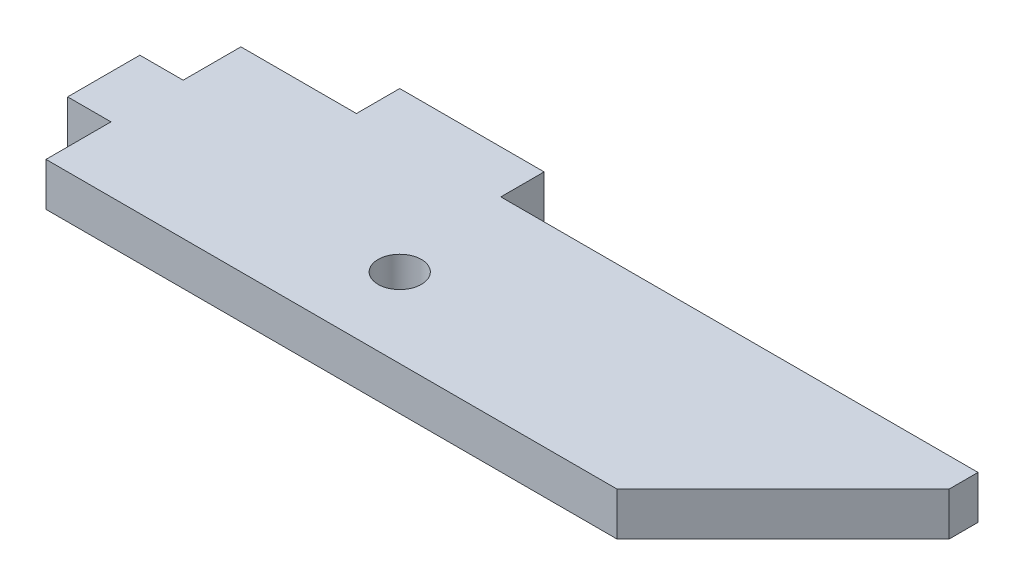
ISO-10303-21;
HEADER;
FILE_DESCRIPTION(('STEP AP214'),'2;1');
FILE_NAME('part.step','',(''),(''),'','','');
FILE_SCHEMA(('AUTOMOTIVE_DESIGN { 1 0 10303 214 1 1 1 1 }'));
ENDSEC;
DATA;
#1=APPLICATION_CONTEXT('core data for automotive mechanical design processes');
#2=APPLICATION_PROTOCOL_DEFINITION('international standard','automotive_design',2000,#1);
#3=PRODUCT_CONTEXT('',#1,'mechanical');
#4=PRODUCT('Part','Part','',(#3));
#5=PRODUCT_RELATED_PRODUCT_CATEGORY('part','',(#4));
#6=PRODUCT_DEFINITION_FORMATION('','',#4);
#7=PRODUCT_DEFINITION_CONTEXT('part definition',#1,'design');
#8=PRODUCT_DEFINITION('design','',#6,#7);
#9=PRODUCT_DEFINITION_SHAPE('','',#8);
#10=(LENGTH_UNIT() NAMED_UNIT(*) SI_UNIT(.MILLI.,.METRE.));
#11=(NAMED_UNIT(*) PLANE_ANGLE_UNIT() SI_UNIT($,.RADIAN.));
#12=(NAMED_UNIT(*) SI_UNIT($,.STERADIAN.) SOLID_ANGLE_UNIT());
#13=UNCERTAINTY_MEASURE_WITH_UNIT(LENGTH_MEASURE(1.E-05),#10,'distance_accuracy_value','');
#14=(GEOMETRIC_REPRESENTATION_CONTEXT(3) GLOBAL_UNCERTAINTY_ASSIGNED_CONTEXT((#13)) GLOBAL_UNIT_ASSIGNED_CONTEXT((#10,
#11,#12)) REPRESENTATION_CONTEXT('',''));
#15=CARTESIAN_POINT('',(0.,0.,0.));
#16=DIRECTION('',(0.,0.,1.));
#17=DIRECTION('',(1.,0.,0.));
#18=AXIS2_PLACEMENT_3D('',#15,#16,#17);
#19=CARTESIAN_POINT('',(0.,3.,0.));
#20=DIRECTION('',(0.,-1.,0.));
#21=DIRECTION('',(0.,0.,-1.));
#22=AXIS2_PLACEMENT_3D('',#19,#20,#21);
#23=PLANE('',#22);
#24=DIRECTION('',(0.,0.,1.));
#25=VECTOR('',#24,1.);
#26=CARTESIAN_POINT('',(-55.3800021183695,3.,9.08659696226554));
#27=LINE('',#26,#25);
#28=CARTESIAN_POINT('',(-55.3800021183695,3.,4.58659696226555));
#29=VERTEX_POINT('',#28);
#30=CARTESIAN_POINT('',(-55.3800021183695,3.,9.08659696226554));
#31=VERTEX_POINT('',#30);
#32=EDGE_CURVE('E185',#29,#31,#27,.T.);
#33=ORIENTED_EDGE('',*,*,#32,.T.);
#34=DIRECTION('',(1.,0.,0.));
#35=VECTOR('',#34,1.);
#36=CARTESIAN_POINT('',(-15.8200021183695,3.,9.08659696226553));
#37=LINE('',#36,#35);
#38=CARTESIAN_POINT('',(-15.8200021183695,3.,9.08659696226553));
#39=VERTEX_POINT('',#38);
#40=EDGE_CURVE('E108',#31,#39,#37,.T.);
#41=ORIENTED_EDGE('',*,*,#40,.T.);
#42=DIRECTION('',(0.707106781186546,0.,-0.707106781186549));
#43=VECTOR('',#42,1.);
#44=CARTESIAN_POINT('',(-4.33000211836955,3.,-2.4034030377345));
#45=LINE('',#44,#43);
#46=CARTESIAN_POINT('',(-4.33000211836955,3.,-2.4034030377345));
#47=VERTEX_POINT('',#46);
#48=EDGE_CURVE('E215',#39,#47,#45,.T.);
#49=ORIENTED_EDGE('',*,*,#48,.T.);
#50=DIRECTION('',(0.,0.,-1.));
#51=VECTOR('',#50,1.);
#52=CARTESIAN_POINT('',(-4.33000211836955,3.,-4.41340303773464));
#53=LINE('',#52,#51);
#54=CARTESIAN_POINT('',(-4.33000211836955,3.,-4.41340303773464));
#55=VERTEX_POINT('',#54);
#56=EDGE_CURVE('E234',#47,#55,#53,.T.);
#57=ORIENTED_EDGE('',*,*,#56,.T.);
#58=DIRECTION('',(-1.,0.,0.));
#59=VECTOR('',#58,1.);
#60=CARTESIAN_POINT('',(-37.3800021183695,3.,-4.41340303773446));
#61=LINE('',#60,#59);
#62=CARTESIAN_POINT('',(-37.3800021183695,3.,-4.41340303773446));
#63=VERTEX_POINT('',#62);
#64=EDGE_CURVE('E231',#55,#63,#61,.T.);
#65=ORIENTED_EDGE('',*,*,#64,.T.);
#66=DIRECTION('',(0.,0.,-1.));
#67=VECTOR('',#66,1.);
#68=CARTESIAN_POINT('',(-37.3800021183695,3.,-7.41340303773446));
#69=LINE('',#68,#67);
#70=CARTESIAN_POINT('',(-37.3800021183695,3.,-7.41340303773446));
#71=VERTEX_POINT('',#70);
#72=EDGE_CURVE('E233',#63,#71,#69,.T.);
#73=ORIENTED_EDGE('',*,*,#72,.T.);
#74=DIRECTION('',(-1.,0.,0.));
#75=VECTOR('',#74,1.);
#76=CARTESIAN_POINT('',(-47.3800021183695,3.,-7.41340303773446));
#77=LINE('',#76,#75);
#78=CARTESIAN_POINT('',(-47.3800021183695,3.,-7.41340303773446));
#79=VERTEX_POINT('',#78);
#80=EDGE_CURVE('E236',#71,#79,#77,.T.);
#81=ORIENTED_EDGE('',*,*,#80,.T.);
#82=DIRECTION('',(0.,0.,1.));
#83=VECTOR('',#82,1.);
#84=CARTESIAN_POINT('',(-47.3800021183695,3.,-7.41340303773446));
#85=LINE('',#84,#83);
#86=CARTESIAN_POINT('',(-47.3800021183695,3.,-4.41340303773446));
#87=VERTEX_POINT('',#86);
#88=EDGE_CURVE('E242',#79,#87,#85,.T.);
#89=ORIENTED_EDGE('',*,*,#88,.T.);
#90=DIRECTION('',(-1.,0.,0.));
#91=VECTOR('',#90,1.);
#92=CARTESIAN_POINT('',(-47.3800021183695,3.,-4.41340303773446));
#93=LINE('',#92,#91);
#94=CARTESIAN_POINT('',(-55.3800021183695,3.,-4.41340303773446));
#95=VERTEX_POINT('',#94);
#96=EDGE_CURVE('E244',#87,#95,#93,.T.);
#97=ORIENTED_EDGE('',*,*,#96,.T.);
#98=DIRECTION('',(0.,0.,1.));
#99=VECTOR('',#98,1.);
#100=CARTESIAN_POINT('',(-55.3800021183696,3.,-0.413403037734454));
#101=LINE('',#100,#99);
#102=CARTESIAN_POINT('',(-55.3800021183696,3.,-0.413403037734454));
#103=VERTEX_POINT('',#102);
#104=EDGE_CURVE('E142',#95,#103,#101,.T.);
#105=ORIENTED_EDGE('',*,*,#104,.T.);
#106=DIRECTION('',(-1.,0.,0.));
#107=VECTOR('',#106,1.);
#108=CARTESIAN_POINT('',(-55.3800021183696,3.,-0.413403037734454));
#109=LINE('',#108,#107);
#110=CARTESIAN_POINT('',(-58.3800021183695,3.,-0.413403037734454));
#111=VERTEX_POINT('',#110);
#112=EDGE_CURVE('E136',#103,#111,#109,.T.);
#113=ORIENTED_EDGE('',*,*,#112,.T.);
#114=DIRECTION('',(0.,0.,1.));
#115=VECTOR('',#114,1.);
#116=CARTESIAN_POINT('',(-58.3800021183695,3.,-0.413403037734454));
#117=LINE('',#116,#115);
#118=CARTESIAN_POINT('',(-58.3800021183696,3.,4.58659696226555));
#119=VERTEX_POINT('',#118);
#120=EDGE_CURVE('E140',#111,#119,#117,.T.);
#121=ORIENTED_EDGE('',*,*,#120,.T.);
#122=DIRECTION('',(1.,0.,0.));
#123=VECTOR('',#122,1.);
#124=CARTESIAN_POINT('',(-58.3800021183696,3.,4.58659696226555));
#125=LINE('',#124,#123);
#126=EDGE_CURVE('E50',#119,#29,#125,.T.);
#127=ORIENTED_EDGE('',*,*,#126,.T.);
#128=EDGE_LOOP('',(#33,#41,#49,#57,#65,#73,#81,#89,#97,#105,#113,#121,#127));
#129=FACE_BOUND('',#128,.T.);
#130=CARTESIAN_POINT('',(-36.3800021183695,3.,3.58659696226536));
#131=DIRECTION('',(0.,1.,0.));
#132=DIRECTION('',(0.,0.,1.));
#133=AXIS2_PLACEMENT_3D('',#130,#131,#132);
#134=CIRCLE('',#133,1.5);
#135=CARTESIAN_POINT('',(-36.3800021183695,3.,5.08659696226537));
#136=VERTEX_POINT('',#135);
#137=EDGE_CURVE('E164',#136,#136,#134,.T.);
#138=ORIENTED_EDGE('',*,*,#137,.F.);
#139=EDGE_LOOP('',(#138));
#140=FACE_BOUND('',#139,.T.);
#141=ADVANCED_FACE('F33',(#129,#140),#23,.F.);
#142=CARTESIAN_POINT('',(0.,0.,0.));
#143=DIRECTION('',(0.,-1.,0.));
#144=DIRECTION('',(0.,0.,-1.));
#145=AXIS2_PLACEMENT_3D('',#142,#143,#144);
#146=PLANE('',#145);
#147=DIRECTION('',(0.,0.,1.));
#148=VECTOR('',#147,1.);
#149=CARTESIAN_POINT('',(-55.3800021183695,0.,9.08659696226554));
#150=LINE('',#149,#148);
#151=CARTESIAN_POINT('',(-55.3800021183695,0.,4.58659696226555));
#152=VERTEX_POINT('',#151);
#153=CARTESIAN_POINT('',(-55.3800021183695,0.,9.08659696226554));
#154=VERTEX_POINT('',#153);
#155=EDGE_CURVE('E160',#152,#154,#150,.T.);
#156=ORIENTED_EDGE('',*,*,#155,.F.);
#157=DIRECTION('',(1.,0.,0.));
#158=VECTOR('',#157,1.);
#159=CARTESIAN_POINT('',(-58.3800021183696,0.,4.58659696226555));
#160=LINE('',#159,#158);
#161=CARTESIAN_POINT('',(-58.3800021183696,0.,4.58659696226555));
#162=VERTEX_POINT('',#161);
#163=EDGE_CURVE('E100',#162,#152,#160,.T.);
#164=ORIENTED_EDGE('',*,*,#163,.F.);
#165=DIRECTION('',(0.,0.,1.));
#166=VECTOR('',#165,1.);
#167=CARTESIAN_POINT('',(-58.3800021183695,0.,-0.413403037734454));
#168=LINE('',#167,#166);
#169=CARTESIAN_POINT('',(-58.3800021183695,0.,-0.413403037734454));
#170=VERTEX_POINT('',#169);
#171=EDGE_CURVE('E94',#170,#162,#168,.T.);
#172=ORIENTED_EDGE('',*,*,#171,.F.);
#173=DIRECTION('',(-1.,0.,0.));
#174=VECTOR('',#173,1.);
#175=CARTESIAN_POINT('',(-55.3800021183696,0.,-0.413403037734454));
#176=LINE('',#175,#174);
#177=CARTESIAN_POINT('',(-55.3800021183696,0.,-0.413403037734454));
#178=VERTEX_POINT('',#177);
#179=EDGE_CURVE('E150',#178,#170,#176,.T.);
#180=ORIENTED_EDGE('',*,*,#179,.F.);
#181=DIRECTION('',(0.,0.,1.));
#182=VECTOR('',#181,1.);
#183=CARTESIAN_POINT('',(-55.3800021183696,0.,-0.413403037734454));
#184=LINE('',#183,#182);
#185=CARTESIAN_POINT('',(-55.3800021183695,0.,-4.41340303773446));
#186=VERTEX_POINT('',#185);
#187=EDGE_CURVE('E180',#186,#178,#184,.T.);
#188=ORIENTED_EDGE('',*,*,#187,.F.);
#189=DIRECTION('',(-1.,0.,0.));
#190=VECTOR('',#189,1.);
#191=CARTESIAN_POINT('',(-47.3800021183695,0.,-4.41340303773446));
#192=LINE('',#191,#190);
#193=CARTESIAN_POINT('',(-47.3800021183695,0.,-4.41340303773446));
#194=VERTEX_POINT('',#193);
#195=EDGE_CURVE('E178',#194,#186,#192,.T.);
#196=ORIENTED_EDGE('',*,*,#195,.F.);
#197=DIRECTION('',(0.,0.,1.));
#198=VECTOR('',#197,1.);
#199=CARTESIAN_POINT('',(-47.3800021183695,0.,-7.41340303773446));
#200=LINE('',#199,#198);
#201=CARTESIAN_POINT('',(-47.3800021183695,0.,-7.41340303773446));
#202=VERTEX_POINT('',#201);
#203=EDGE_CURVE('E176',#202,#194,#200,.T.);
#204=ORIENTED_EDGE('',*,*,#203,.F.);
#205=DIRECTION('',(-1.,0.,0.));
#206=VECTOR('',#205,1.);
#207=CARTESIAN_POINT('',(-47.3800021183695,0.,-7.41340303773446));
#208=LINE('',#207,#206);
#209=CARTESIAN_POINT('',(-37.3800021183695,0.,-7.41340303773446));
#210=VERTEX_POINT('',#209);
#211=EDGE_CURVE('E174',#210,#202,#208,.T.);
#212=ORIENTED_EDGE('',*,*,#211,.F.);
#213=DIRECTION('',(0.,0.,-1.));
#214=VECTOR('',#213,1.);
#215=CARTESIAN_POINT('',(-37.3800021183695,0.,-7.41340303773446));
#216=LINE('',#215,#214);
#217=CARTESIAN_POINT('',(-37.3800021183695,0.,-4.41340303773446));
#218=VERTEX_POINT('',#217);
#219=EDGE_CURVE('E172',#218,#210,#216,.T.);
#220=ORIENTED_EDGE('',*,*,#219,.F.);
#221=DIRECTION('',(-1.,0.,0.));
#222=VECTOR('',#221,1.);
#223=CARTESIAN_POINT('',(-37.3800021183695,0.,-4.41340303773446));
#224=LINE('',#223,#222);
#225=CARTESIAN_POINT('',(-4.33000211836955,0.,-4.41340303773464));
#226=VERTEX_POINT('',#225);
#227=EDGE_CURVE('E170',#226,#218,#224,.T.);
#228=ORIENTED_EDGE('',*,*,#227,.F.);
#229=DIRECTION('',(0.,0.,-1.));
#230=VECTOR('',#229,1.);
#231=CARTESIAN_POINT('',(-4.33000211836955,0.,-4.41340303773464));
#232=LINE('',#231,#230);
#233=CARTESIAN_POINT('',(-4.33000211836955,0.,-2.4034030377345));
#234=VERTEX_POINT('',#233);
#235=EDGE_CURVE('E168',#234,#226,#232,.T.);
#236=ORIENTED_EDGE('',*,*,#235,.F.);
#237=DIRECTION('',(0.707106781186546,0.,-0.707106781186549));
#238=VECTOR('',#237,1.);
#239=CARTESIAN_POINT('',(-4.33000211836955,0.,-2.4034030377345));
#240=LINE('',#239,#238);
#241=CARTESIAN_POINT('',(-15.8200021183695,0.,9.08659696226553));
#242=VERTEX_POINT('',#241);
#243=EDGE_CURVE('E166',#242,#234,#240,.T.);
#244=ORIENTED_EDGE('',*,*,#243,.F.);
#245=DIRECTION('',(1.,0.,0.));
#246=VECTOR('',#245,1.);
#247=CARTESIAN_POINT('',(-15.8200021183695,0.,9.08659696226553));
#248=LINE('',#247,#246);
#249=EDGE_CURVE('E163',#154,#242,#248,.T.);
#250=ORIENTED_EDGE('',*,*,#249,.F.);
#251=EDGE_LOOP('',(#156,#164,#172,#180,#188,#196,#204,#212,#220,#228,#236,#244,#250));
#252=FACE_BOUND('',#251,.T.);
#253=CARTESIAN_POINT('',(-36.3800021183695,0.,3.58659696226536));
#254=DIRECTION('',(0.,1.,0.));
#255=DIRECTION('',(0.,0.,1.));
#256=AXIS2_PLACEMENT_3D('',#253,#254,#255);
#257=CIRCLE('',#256,1.5);
#258=CARTESIAN_POINT('',(-36.3800021183695,0.,5.08659696226537));
#259=VERTEX_POINT('',#258);
#260=EDGE_CURVE('E404',#259,#259,#257,.T.);
#261=ORIENTED_EDGE('',*,*,#260,.T.);
#262=EDGE_LOOP('',(#261));
#263=FACE_BOUND('',#262,.T.);
#264=ADVANCED_FACE('F219',(#252,#263),#146,.T.);
#265=CARTESIAN_POINT('',(-55.3800021183695,3.,9.08659696226554));
#266=DIRECTION('',(1.,0.,0.));
#267=DIRECTION('',(0.,0.,-1.));
#268=AXIS2_PLACEMENT_3D('',#265,#266,#267);
#269=PLANE('',#268);
#270=ORIENTED_EDGE('',*,*,#155,.T.);
#271=DIRECTION('',(0.,-1.,0.));
#272=VECTOR('',#271,1.);
#273=CARTESIAN_POINT('',(-55.3800021183695,3.,9.08659696226554));
#274=LINE('',#273,#272);
#275=EDGE_CURVE('E11',#31,#154,#274,.T.);
#276=ORIENTED_EDGE('',*,*,#275,.F.);
#277=ORIENTED_EDGE('',*,*,#32,.F.);
#278=DIRECTION('',(0.,-1.,0.));
#279=VECTOR('',#278,1.);
#280=CARTESIAN_POINT('',(-55.3800021183695,3.,4.58659696226555));
#281=LINE('',#280,#279);
#282=EDGE_CURVE('E156',#29,#152,#281,.T.);
#283=ORIENTED_EDGE('',*,*,#282,.T.);
#284=EDGE_LOOP('',(#270,#276,#277,#283));
#285=FACE_BOUND('',#284,.T.);
#286=ADVANCED_FACE('F35',(#285),#269,.F.);
#287=CARTESIAN_POINT('',(-15.8200021183695,3.,9.08659696226553));
#288=DIRECTION('',(0.,0.,-1.));
#289=DIRECTION('',(-1.,0.,0.));
#290=AXIS2_PLACEMENT_3D('',#287,#288,#289);
#291=PLANE('',#290);
#292=ORIENTED_EDGE('',*,*,#249,.T.);
#293=DIRECTION('',(0.,-1.,0.));
#294=VECTOR('',#293,1.);
#295=CARTESIAN_POINT('',(-15.8200021183695,3.,9.08659696226553));
#296=LINE('',#295,#294);
#297=EDGE_CURVE('E42',#39,#242,#296,.T.);
#298=ORIENTED_EDGE('',*,*,#297,.F.);
#299=ORIENTED_EDGE('',*,*,#40,.F.);
#300=ORIENTED_EDGE('',*,*,#275,.T.);
#301=EDGE_LOOP('',(#292,#298,#299,#300));
#302=FACE_BOUND('',#301,.T.);
#303=ADVANCED_FACE('F278',(#302),#291,.F.);
#304=CARTESIAN_POINT('',(-4.33000211836955,3.,-2.4034030377345));
#305=DIRECTION('',(-0.707106781186549,0.,-0.707106781186546));
#306=DIRECTION('',(-0.707106781186546,0.,0.707106781186549));
#307=AXIS2_PLACEMENT_3D('',#304,#305,#306);
#308=PLANE('',#307);
#309=ORIENTED_EDGE('',*,*,#243,.T.);
#310=DIRECTION('',(0.,-1.,0.));
#311=VECTOR('',#310,1.);
#312=CARTESIAN_POINT('',(-4.33000211836955,3.,-2.4034030377345));
#313=LINE('',#312,#311);
#314=EDGE_CURVE('E207',#47,#234,#313,.T.);
#315=ORIENTED_EDGE('',*,*,#314,.F.);
#316=ORIENTED_EDGE('',*,*,#48,.F.);
#317=ORIENTED_EDGE('',*,*,#297,.T.);
#318=EDGE_LOOP('',(#309,#315,#316,#317));
#319=FACE_BOUND('',#318,.T.);
#320=ADVANCED_FACE('F213',(#319),#308,.F.);
#321=CARTESIAN_POINT('',(-4.33000211836955,3.,-4.41340303773464));
#322=DIRECTION('',(-1.,0.,0.));
#323=DIRECTION('',(0.,0.,1.));
#324=AXIS2_PLACEMENT_3D('',#321,#322,#323);
#325=PLANE('',#324);
#326=ORIENTED_EDGE('',*,*,#235,.T.);
#327=DIRECTION('',(0.,-1.,0.));
#328=VECTOR('',#327,1.);
#329=CARTESIAN_POINT('',(-4.33000211836955,3.,-4.41340303773464));
#330=LINE('',#329,#328);
#331=EDGE_CURVE('E204',#55,#226,#330,.T.);
#332=ORIENTED_EDGE('',*,*,#331,.F.);
#333=ORIENTED_EDGE('',*,*,#56,.F.);
#334=ORIENTED_EDGE('',*,*,#314,.T.);
#335=EDGE_LOOP('',(#326,#332,#333,#334));
#336=FACE_BOUND('',#335,.T.);
#337=ADVANCED_FACE('F225',(#336),#325,.F.);
#338=CARTESIAN_POINT('',(-37.3800021183695,3.,-4.41340303773446));
#339=DIRECTION('',(0.,0.,1.));
#340=DIRECTION('',(1.,0.,0.));
#341=AXIS2_PLACEMENT_3D('',#338,#339,#340);
#342=PLANE('',#341);
#343=ORIENTED_EDGE('',*,*,#227,.T.);
#344=DIRECTION('',(0.,-1.,0.));
#345=VECTOR('',#344,1.);
#346=CARTESIAN_POINT('',(-37.3800021183695,3.,-4.41340303773446));
#347=LINE('',#346,#345);
#348=EDGE_CURVE('E201',#63,#218,#347,.T.);
#349=ORIENTED_EDGE('',*,*,#348,.F.);
#350=ORIENTED_EDGE('',*,*,#64,.F.);
#351=ORIENTED_EDGE('',*,*,#331,.T.);
#352=EDGE_LOOP('',(#343,#349,#350,#351));
#353=FACE_BOUND('',#352,.T.);
#354=ADVANCED_FACE('F229',(#353),#342,.F.);
#355=CARTESIAN_POINT('',(-37.3800021183695,3.,-7.41340303773446));
#356=DIRECTION('',(-1.,0.,0.));
#357=DIRECTION('',(0.,0.,1.));
#358=AXIS2_PLACEMENT_3D('',#355,#356,#357);
#359=PLANE('',#358);
#360=ORIENTED_EDGE('',*,*,#219,.T.);
#361=DIRECTION('',(0.,-1.,0.));
#362=VECTOR('',#361,1.);
#363=CARTESIAN_POINT('',(-37.3800021183695,3.,-7.41340303773446));
#364=LINE('',#363,#362);
#365=EDGE_CURVE('E198',#71,#210,#364,.T.);
#366=ORIENTED_EDGE('',*,*,#365,.F.);
#367=ORIENTED_EDGE('',*,*,#72,.F.);
#368=ORIENTED_EDGE('',*,*,#348,.T.);
#369=EDGE_LOOP('',(#360,#366,#367,#368));
#370=FACE_BOUND('',#369,.T.);
#371=ADVANCED_FACE('F291',(#370),#359,.F.);
#372=CARTESIAN_POINT('',(-47.3800021183695,3.,-7.41340303773446));
#373=DIRECTION('',(0.,0.,1.));
#374=DIRECTION('',(1.,0.,0.));
#375=AXIS2_PLACEMENT_3D('',#372,#373,#374);
#376=PLANE('',#375);
#377=ORIENTED_EDGE('',*,*,#211,.T.);
#378=DIRECTION('',(0.,-1.,0.));
#379=VECTOR('',#378,1.);
#380=CARTESIAN_POINT('',(-47.3800021183695,3.,-7.41340303773446));
#381=LINE('',#380,#379);
#382=EDGE_CURVE('E195',#79,#202,#381,.T.);
#383=ORIENTED_EDGE('',*,*,#382,.F.);
#384=ORIENTED_EDGE('',*,*,#80,.F.);
#385=ORIENTED_EDGE('',*,*,#365,.T.);
#386=EDGE_LOOP('',(#377,#383,#384,#385));
#387=FACE_BOUND('',#386,.T.);
#388=ADVANCED_FACE('F294',(#387),#376,.F.);
#389=CARTESIAN_POINT('',(-47.3800021183695,3.,-7.41340303773446));
#390=DIRECTION('',(1.,0.,0.));
#391=DIRECTION('',(0.,0.,-1.));
#392=AXIS2_PLACEMENT_3D('',#389,#390,#391);
#393=PLANE('',#392);
#394=ORIENTED_EDGE('',*,*,#203,.T.);
#395=DIRECTION('',(0.,-1.,0.));
#396=VECTOR('',#395,1.);
#397=CARTESIAN_POINT('',(-47.3800021183695,3.,-4.41340303773446));
#398=LINE('',#397,#396);
#399=EDGE_CURVE('E192',#87,#194,#398,.T.);
#400=ORIENTED_EDGE('',*,*,#399,.F.);
#401=ORIENTED_EDGE('',*,*,#88,.F.);
#402=ORIENTED_EDGE('',*,*,#382,.T.);
#403=EDGE_LOOP('',(#394,#400,#401,#402));
#404=FACE_BOUND('',#403,.T.);
#405=ADVANCED_FACE('F298',(#404),#393,.F.);
#406=CARTESIAN_POINT('',(-47.3800021183695,3.,-4.41340303773446));
#407=DIRECTION('',(0.,0.,1.));
#408=DIRECTION('',(1.,0.,0.));
#409=AXIS2_PLACEMENT_3D('',#406,#407,#408);
#410=PLANE('',#409);
#411=ORIENTED_EDGE('',*,*,#195,.T.);
#412=DIRECTION('',(0.,-1.,0.));
#413=VECTOR('',#412,1.);
#414=CARTESIAN_POINT('',(-55.3800021183695,3.,-4.41340303773446));
#415=LINE('',#414,#413);
#416=EDGE_CURVE('E189',#95,#186,#415,.T.);
#417=ORIENTED_EDGE('',*,*,#416,.F.);
#418=ORIENTED_EDGE('',*,*,#96,.F.);
#419=ORIENTED_EDGE('',*,*,#399,.T.);
#420=EDGE_LOOP('',(#411,#417,#418,#419));
#421=FACE_BOUND('',#420,.T.);
#422=ADVANCED_FACE('F250',(#421),#410,.F.);
#423=CARTESIAN_POINT('',(-55.3800021183696,3.,-0.413403037734454));
#424=DIRECTION('',(1.,0.,0.));
#425=DIRECTION('',(0.,0.,-1.));
#426=AXIS2_PLACEMENT_3D('',#423,#424,#425);
#427=PLANE('',#426);
#428=ORIENTED_EDGE('',*,*,#187,.T.);
#429=DIRECTION('',(0.,-1.,0.));
#430=VECTOR('',#429,1.);
#431=CARTESIAN_POINT('',(-55.3800021183696,3.,-0.413403037734454));
#432=LINE('',#431,#430);
#433=EDGE_CURVE('E151',#103,#178,#432,.T.);
#434=ORIENTED_EDGE('',*,*,#433,.F.);
#435=ORIENTED_EDGE('',*,*,#104,.F.);
#436=ORIENTED_EDGE('',*,*,#416,.T.);
#437=EDGE_LOOP('',(#428,#434,#435,#436));
#438=FACE_BOUND('',#437,.T.);
#439=ADVANCED_FACE('F254',(#438),#427,.F.);
#440=CARTESIAN_POINT('',(-55.3800021183696,3.,-0.413403037734454));
#441=DIRECTION('',(0.,0.,1.));
#442=DIRECTION('',(1.,0.,0.));
#443=AXIS2_PLACEMENT_3D('',#440,#441,#442);
#444=PLANE('',#443);
#445=ORIENTED_EDGE('',*,*,#179,.T.);
#446=DIRECTION('',(0.,-1.,0.));
#447=VECTOR('',#446,1.);
#448=CARTESIAN_POINT('',(-58.3800021183695,3.,-0.413403037734454));
#449=LINE('',#448,#447);
#450=EDGE_CURVE('E147',#111,#170,#449,.T.);
#451=ORIENTED_EDGE('',*,*,#450,.F.);
#452=ORIENTED_EDGE('',*,*,#112,.F.);
#453=ORIENTED_EDGE('',*,*,#433,.T.);
#454=EDGE_LOOP('',(#445,#451,#452,#453));
#455=FACE_BOUND('',#454,.T.);
#456=ADVANCED_FACE('F148',(#455),#444,.F.);
#457=CARTESIAN_POINT('',(-58.3800021183695,3.,-0.413403037734454));
#458=DIRECTION('',(1.,0.,0.));
#459=DIRECTION('',(0.,0.,-1.));
#460=AXIS2_PLACEMENT_3D('',#457,#458,#459);
#461=PLANE('',#460);
#462=ORIENTED_EDGE('',*,*,#171,.T.);
#463=DIRECTION('',(0.,-1.,0.));
#464=VECTOR('',#463,1.);
#465=CARTESIAN_POINT('',(-58.3800021183696,3.,4.58659696226555));
#466=LINE('',#465,#464);
#467=EDGE_CURVE('E152',#119,#162,#466,.T.);
#468=ORIENTED_EDGE('',*,*,#467,.F.);
#469=ORIENTED_EDGE('',*,*,#120,.F.);
#470=ORIENTED_EDGE('',*,*,#450,.T.);
#471=EDGE_LOOP('',(#462,#468,#469,#470));
#472=FACE_BOUND('',#471,.T.);
#473=ADVANCED_FACE('F154',(#472),#461,.F.);
#474=CARTESIAN_POINT('',(-58.3800021183696,3.,4.58659696226555));
#475=DIRECTION('',(0.,0.,-1.));
#476=DIRECTION('',(-1.,0.,0.));
#477=AXIS2_PLACEMENT_3D('',#474,#475,#476);
#478=PLANE('',#477);
#479=ORIENTED_EDGE('',*,*,#163,.T.);
#480=ORIENTED_EDGE('',*,*,#282,.F.);
#481=ORIENTED_EDGE('',*,*,#126,.F.);
#482=ORIENTED_EDGE('',*,*,#467,.T.);
#483=EDGE_LOOP('',(#479,#480,#481,#482));
#484=FACE_BOUND('',#483,.T.);
#485=ADVANCED_FACE('F258',(#484),#478,.F.);
#486=CARTESIAN_POINT('',(-36.3800021183695,3.,3.58659696226536));
#487=DIRECTION('',(0.,-1.,0.));
#488=DIRECTION('',(0.,0.,-1.));
#489=AXIS2_PLACEMENT_3D('',#486,#487,#488);
#490=CYLINDRICAL_SURFACE('',#489,1.5);
#491=ORIENTED_EDGE('',*,*,#137,.T.);
#492=EDGE_LOOP('',(#491));
#493=FACE_BOUND('',#492,.T.);
#494=ORIENTED_EDGE('',*,*,#260,.F.);
#495=EDGE_LOOP('',(#494));
#496=FACE_BOUND('',#495,.T.);
#497=ADVANCED_FACE('F260',(#493,#496),#490,.F.);
#498=CLOSED_SHELL('',(#141,#264,#286,#303,#320,#337,#354,#371,#388,#405,#422,#439,#456,#473,
#485,#497));
#499=MANIFOLD_SOLID_BREP('B2',#498);
#500=ADVANCED_BREP_SHAPE_REPRESENTATION('',(#18,#499),#14);
#501=SHAPE_DEFINITION_REPRESENTATION(#9,#500);
ENDSEC;
END-ISO-10303-21;
